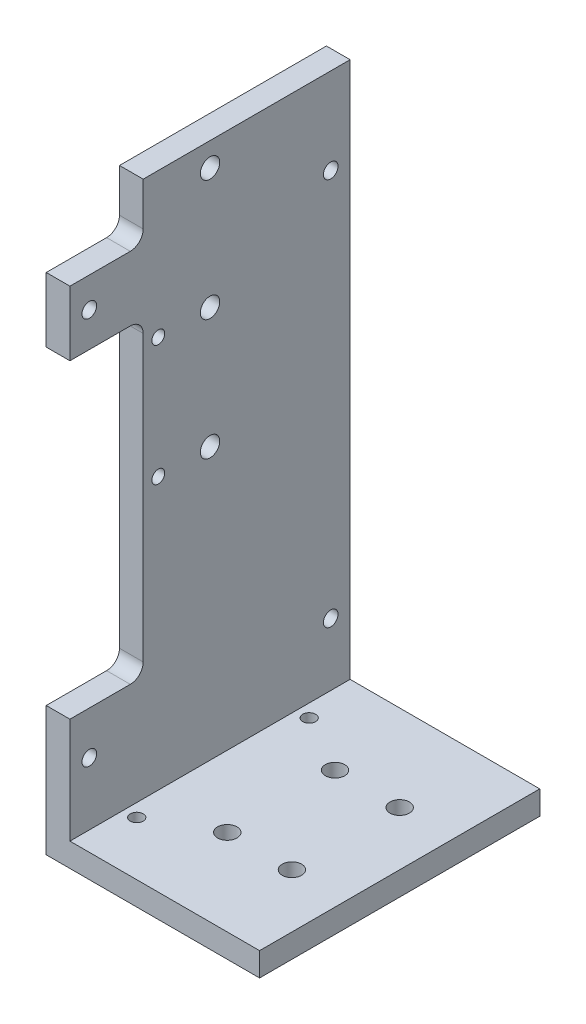
ISO-10303-21;
HEADER;
FILE_DESCRIPTION(('STEP AP214'),'2;1');
FILE_NAME('part.step','',(''),(''),'','','');
FILE_SCHEMA(('AUTOMOTIVE_DESIGN { 1 0 10303 214 1 1 1 1 }'));
ENDSEC;
DATA;
#1=APPLICATION_CONTEXT('core data for automotive mechanical design processes');
#2=APPLICATION_PROTOCOL_DEFINITION('international standard','automotive_design',2000,#1);
#3=PRODUCT_CONTEXT('',#1,'mechanical');
#4=PRODUCT('Part','Part','',(#3));
#5=PRODUCT_RELATED_PRODUCT_CATEGORY('part','',(#4));
#6=PRODUCT_DEFINITION_FORMATION('','',#4);
#7=PRODUCT_DEFINITION_CONTEXT('part definition',#1,'design');
#8=PRODUCT_DEFINITION('design','',#6,#7);
#9=PRODUCT_DEFINITION_SHAPE('','',#8);
#10=(LENGTH_UNIT() NAMED_UNIT(*) SI_UNIT(.MILLI.,.METRE.));
#11=(NAMED_UNIT(*) PLANE_ANGLE_UNIT() SI_UNIT($,.RADIAN.));
#12=(NAMED_UNIT(*) SI_UNIT($,.STERADIAN.) SOLID_ANGLE_UNIT());
#13=UNCERTAINTY_MEASURE_WITH_UNIT(LENGTH_MEASURE(1.E-05),#10,'distance_accuracy_value','');
#14=(GEOMETRIC_REPRESENTATION_CONTEXT(3) GLOBAL_UNCERTAINTY_ASSIGNED_CONTEXT((#13)) GLOBAL_UNIT_ASSIGNED_CONTEXT((#10,
#11,#12)) REPRESENTATION_CONTEXT('',''));
#15=CARTESIAN_POINT('',(0.,0.,0.));
#16=DIRECTION('',(0.,0.,1.));
#17=DIRECTION('',(1.,0.,0.));
#18=AXIS2_PLACEMENT_3D('',#15,#16,#17);
#19=CARTESIAN_POINT('',(22.,0.,12.5));
#20=DIRECTION('',(0.,-1.,0.));
#21=DIRECTION('',(0.,0.,-1.));
#22=AXIS2_PLACEMENT_3D('',#19,#20,#21);
#23=CYLINDRICAL_SURFACE('',#22,2.25);
#24=CARTESIAN_POINT('',(22.,0.,12.5));
#25=DIRECTION('',(0.,-1.,0.));
#26=DIRECTION('',(0.,0.,-1.));
#27=AXIS2_PLACEMENT_3D('',#24,#25,#26);
#28=CIRCLE('',#27,2.25);
#29=CARTESIAN_POINT('',(22.,0.,10.25));
#30=VERTEX_POINT('',#29);
#31=EDGE_CURVE('E271',#30,#30,#28,.F.);
#32=ORIENTED_EDGE('',*,*,#31,.F.);
#33=EDGE_LOOP('',(#32));
#34=FACE_BOUND('',#33,.T.);
#35=CARTESIAN_POINT('',(22.,5.5,12.5));
#36=DIRECTION('',(0.,-1.,0.));
#37=DIRECTION('',(0.,0.,-1.));
#38=AXIS2_PLACEMENT_3D('',#35,#36,#37);
#39=CIRCLE('',#38,2.25);
#40=CARTESIAN_POINT('',(22.,5.5,10.25));
#41=VERTEX_POINT('',#40);
#42=EDGE_CURVE('E19',#41,#41,#39,.T.);
#43=ORIENTED_EDGE('',*,*,#42,.F.);
#44=EDGE_LOOP('',(#43));
#45=FACE_BOUND('',#44,.T.);
#46=ADVANCED_FACE('F16',(#34,#45),#23,.F.);
#47=CARTESIAN_POINT('',(22.,0.,-12.5));
#48=DIRECTION('',(0.,-1.,0.));
#49=DIRECTION('',(0.,0.,-1.));
#50=AXIS2_PLACEMENT_3D('',#47,#48,#49);
#51=CYLINDRICAL_SURFACE('',#50,2.25);
#52=CARTESIAN_POINT('',(22.,0.,-12.5));
#53=DIRECTION('',(0.,-1.,0.));
#54=DIRECTION('',(0.,0.,-1.));
#55=AXIS2_PLACEMENT_3D('',#52,#53,#54);
#56=CIRCLE('',#55,2.25);
#57=CARTESIAN_POINT('',(22.,0.,-14.75));
#58=VERTEX_POINT('',#57);
#59=EDGE_CURVE('E268',#58,#58,#56,.F.);
#60=ORIENTED_EDGE('',*,*,#59,.F.);
#61=EDGE_LOOP('',(#60));
#62=FACE_BOUND('',#61,.T.);
#63=CARTESIAN_POINT('',(22.,5.5,-12.5));
#64=DIRECTION('',(0.,-1.,0.));
#65=DIRECTION('',(0.,0.,-1.));
#66=AXIS2_PLACEMENT_3D('',#63,#64,#65);
#67=CIRCLE('',#66,2.25);
#68=CARTESIAN_POINT('',(22.,5.5,-14.75));
#69=VERTEX_POINT('',#68);
#70=EDGE_CURVE('E299',#69,#69,#67,.T.);
#71=ORIENTED_EDGE('',*,*,#70,.F.);
#72=EDGE_LOOP('',(#71));
#73=FACE_BOUND('',#72,.T.);
#74=ADVANCED_FACE('F309',(#62,#73),#51,.F.);
#75=CARTESIAN_POINT('',(37.,0.,-12.5));
#76=DIRECTION('',(0.,-1.,0.));
#77=DIRECTION('',(0.,0.,-1.));
#78=AXIS2_PLACEMENT_3D('',#75,#76,#77);
#79=CYLINDRICAL_SURFACE('',#78,2.25);
#80=CARTESIAN_POINT('',(37.,0.,-12.5));
#81=DIRECTION('',(0.,-1.,0.));
#82=DIRECTION('',(0.,0.,-1.));
#83=AXIS2_PLACEMENT_3D('',#80,#81,#82);
#84=CIRCLE('',#83,2.25);
#85=CARTESIAN_POINT('',(37.,0.,-14.75));
#86=VERTEX_POINT('',#85);
#87=EDGE_CURVE('E265',#86,#86,#84,.F.);
#88=ORIENTED_EDGE('',*,*,#87,.F.);
#89=EDGE_LOOP('',(#88));
#90=FACE_BOUND('',#89,.T.);
#91=CARTESIAN_POINT('',(37.,5.5,-12.5));
#92=DIRECTION('',(0.,-1.,0.));
#93=DIRECTION('',(0.,0.,-1.));
#94=AXIS2_PLACEMENT_3D('',#91,#92,#93);
#95=CIRCLE('',#94,2.25);
#96=CARTESIAN_POINT('',(37.,5.5,-14.75));
#97=VERTEX_POINT('',#96);
#98=EDGE_CURVE('E297',#97,#97,#95,.T.);
#99=ORIENTED_EDGE('',*,*,#98,.F.);
#100=EDGE_LOOP('',(#99));
#101=FACE_BOUND('',#100,.T.);
#102=ADVANCED_FACE('F315',(#90,#101),#79,.F.);
#103=CARTESIAN_POINT('',(37.,0.,12.5));
#104=DIRECTION('',(0.,-1.,0.));
#105=DIRECTION('',(0.,0.,-1.));
#106=AXIS2_PLACEMENT_3D('',#103,#104,#105);
#107=CYLINDRICAL_SURFACE('',#106,2.25);
#108=CARTESIAN_POINT('',(37.,0.,12.5));
#109=DIRECTION('',(0.,-1.,0.));
#110=DIRECTION('',(0.,0.,-1.));
#111=AXIS2_PLACEMENT_3D('',#108,#109,#110);
#112=CIRCLE('',#111,2.25);
#113=CARTESIAN_POINT('',(37.,0.,10.25));
#114=VERTEX_POINT('',#113);
#115=EDGE_CURVE('E262',#114,#114,#112,.F.);
#116=ORIENTED_EDGE('',*,*,#115,.F.);
#117=EDGE_LOOP('',(#116));
#118=FACE_BOUND('',#117,.T.);
#119=CARTESIAN_POINT('',(37.,5.5,12.5));
#120=DIRECTION('',(0.,-1.,0.));
#121=DIRECTION('',(0.,0.,-1.));
#122=AXIS2_PLACEMENT_3D('',#119,#120,#121);
#123=CIRCLE('',#122,2.25);
#124=CARTESIAN_POINT('',(37.,5.5,10.25));
#125=VERTEX_POINT('',#124);
#126=EDGE_CURVE('E294',#125,#125,#123,.T.);
#127=ORIENTED_EDGE('',*,*,#126,.F.);
#128=EDGE_LOOP('',(#127));
#129=FACE_BOUND('',#128,.T.);
#130=ADVANCED_FACE('F426',(#118,#129),#107,.F.);
#131=CARTESIAN_POINT('',(8.5,0.,-20.));
#132=DIRECTION('',(0.,-1.,0.));
#133=DIRECTION('',(0.,0.,-1.));
#134=AXIS2_PLACEMENT_3D('',#131,#132,#133);
#135=CYLINDRICAL_SURFACE('',#134,1.49499999999999);
#136=CARTESIAN_POINT('',(8.5,0.,-20.));
#137=DIRECTION('',(0.,-1.,0.));
#138=DIRECTION('',(0.,0.,-1.));
#139=AXIS2_PLACEMENT_3D('',#136,#137,#138);
#140=CIRCLE('',#139,1.49499999999999);
#141=CARTESIAN_POINT('',(8.5,0.,-21.495));
#142=VERTEX_POINT('',#141);
#143=EDGE_CURVE('E259',#142,#142,#140,.F.);
#144=ORIENTED_EDGE('',*,*,#143,.F.);
#145=EDGE_LOOP('',(#144));
#146=FACE_BOUND('',#145,.T.);
#147=CARTESIAN_POINT('',(8.5,5.5,-20.));
#148=DIRECTION('',(0.,-1.,0.));
#149=DIRECTION('',(0.,0.,-1.));
#150=AXIS2_PLACEMENT_3D('',#147,#148,#149);
#151=CIRCLE('',#150,1.49499999999999);
#152=CARTESIAN_POINT('',(8.5,5.5,-21.495));
#153=VERTEX_POINT('',#152);
#154=EDGE_CURVE('E291',#153,#153,#151,.T.);
#155=ORIENTED_EDGE('',*,*,#154,.F.);
#156=EDGE_LOOP('',(#155));
#157=FACE_BOUND('',#156,.T.);
#158=ADVANCED_FACE('F422',(#146,#157),#135,.F.);
#159=CARTESIAN_POINT('',(8.5,0.,20.));
#160=DIRECTION('',(0.,-1.,0.));
#161=DIRECTION('',(0.,0.,-1.));
#162=AXIS2_PLACEMENT_3D('',#159,#160,#161);
#163=CYLINDRICAL_SURFACE('',#162,1.49499999999999);
#164=CARTESIAN_POINT('',(8.5,0.,20.));
#165=DIRECTION('',(0.,-1.,0.));
#166=DIRECTION('',(0.,0.,-1.));
#167=AXIS2_PLACEMENT_3D('',#164,#165,#166);
#168=CIRCLE('',#167,1.49499999999999);
#169=CARTESIAN_POINT('',(8.5,0.,18.505));
#170=VERTEX_POINT('',#169);
#171=EDGE_CURVE('E255',#170,#170,#168,.F.);
#172=ORIENTED_EDGE('',*,*,#171,.F.);
#173=EDGE_LOOP('',(#172));
#174=FACE_BOUND('',#173,.T.);
#175=CARTESIAN_POINT('',(8.5,5.5,20.));
#176=DIRECTION('',(0.,-1.,0.));
#177=DIRECTION('',(0.,0.,-1.));
#178=AXIS2_PLACEMENT_3D('',#175,#176,#177);
#179=CIRCLE('',#178,1.49499999999999);
#180=CARTESIAN_POINT('',(8.5,5.5,18.505));
#181=VERTEX_POINT('',#180);
#182=EDGE_CURVE('E175',#181,#181,#179,.T.);
#183=ORIENTED_EDGE('',*,*,#182,.F.);
#184=EDGE_LOOP('',(#183));
#185=FACE_BOUND('',#184,.T.);
#186=ADVANCED_FACE('F418',(#174,#185),#163,.F.);
#187=CARTESIAN_POINT('',(5.50000000000001,5.5,-32.5));
#188=DIRECTION('',(0.,1.,0.));
#189=DIRECTION('',(0.,0.,1.));
#190=AXIS2_PLACEMENT_3D('',#187,#188,#189);
#191=PLANE('',#190);
#192=DIRECTION('',(0.,0.,-1.));
#193=VECTOR('',#192,1.);
#194=CARTESIAN_POINT('',(49.5,5.5,-32.5));
#195=LINE('',#194,#193);
#196=CARTESIAN_POINT('',(49.5,5.5,-32.5));
#197=VERTEX_POINT('',#196);
#198=CARTESIAN_POINT('',(49.5,5.5,32.5));
#199=VERTEX_POINT('',#198);
#200=EDGE_CURVE('E165',#197,#199,#195,.F.);
#201=ORIENTED_EDGE('',*,*,#200,.F.);
#202=DIRECTION('',(-1.,0.,0.));
#203=VECTOR('',#202,1.);
#204=CARTESIAN_POINT('',(0.,5.5,-32.5));
#205=LINE('',#204,#203);
#206=CARTESIAN_POINT('',(5.50000000000001,5.49999999999999,-32.5));
#207=VERTEX_POINT('',#206);
#208=EDGE_CURVE('E686',#207,#197,#205,.F.);
#209=ORIENTED_EDGE('',*,*,#208,.F.);
#210=DIRECTION('',(0.,0.,1.));
#211=VECTOR('',#210,1.);
#212=CARTESIAN_POINT('',(5.50000000000001,5.49999999999999,-32.5));
#213=LINE('',#212,#211);
#214=CARTESIAN_POINT('',(5.50000000000001,5.49999999999999,32.5));
#215=VERTEX_POINT('',#214);
#216=EDGE_CURVE('E163',#215,#207,#213,.F.);
#217=ORIENTED_EDGE('',*,*,#216,.F.);
#218=DIRECTION('',(-1.,0.,0.));
#219=VECTOR('',#218,1.);
#220=CARTESIAN_POINT('',(0.,5.5,32.5));
#221=LINE('',#220,#219);
#222=EDGE_CURVE('E689',#215,#199,#221,.F.);
#223=ORIENTED_EDGE('',*,*,#222,.T.);
#224=EDGE_LOOP('',(#201,#209,#217,#223));
#225=FACE_BOUND('',#224,.T.);
#226=ORIENTED_EDGE('',*,*,#182,.T.);
#227=EDGE_LOOP('',(#226));
#228=FACE_BOUND('',#227,.T.);
#229=ORIENTED_EDGE('',*,*,#154,.T.);
#230=EDGE_LOOP('',(#229));
#231=FACE_BOUND('',#230,.T.);
#232=ORIENTED_EDGE('',*,*,#126,.T.);
#233=EDGE_LOOP('',(#232));
#234=FACE_BOUND('',#233,.T.);
#235=ORIENTED_EDGE('',*,*,#98,.T.);
#236=EDGE_LOOP('',(#235));
#237=FACE_BOUND('',#236,.T.);
#238=ORIENTED_EDGE('',*,*,#70,.T.);
#239=EDGE_LOOP('',(#238));
#240=FACE_BOUND('',#239,.T.);
#241=ORIENTED_EDGE('',*,*,#42,.T.);
#242=EDGE_LOOP('',(#241));
#243=FACE_BOUND('',#242,.T.);
#244=ADVANCED_FACE('F306',(#225,#228,#231,#234,#237,#240,#243),#191,.T.);
#245=CARTESIAN_POINT('',(49.5,5.5,-32.5));
#246=DIRECTION('',(1.,0.,0.));
#247=DIRECTION('',(0.,0.,-1.));
#248=AXIS2_PLACEMENT_3D('',#245,#246,#247);
#249=PLANE('',#248);
#250=DIRECTION('',(0.,0.,1.));
#251=VECTOR('',#250,1.);
#252=CARTESIAN_POINT('',(49.5,0.,-32.5));
#253=LINE('',#252,#251);
#254=CARTESIAN_POINT('',(49.5,0.,-32.5));
#255=VERTEX_POINT('',#254);
#256=CARTESIAN_POINT('',(49.5,0.,32.5));
#257=VERTEX_POINT('',#256);
#258=EDGE_CURVE('E258',#255,#257,#253,.T.);
#259=ORIENTED_EDGE('',*,*,#258,.F.);
#260=DIRECTION('',(0.,1.,0.));
#261=VECTOR('',#260,1.);
#262=CARTESIAN_POINT('',(49.5,0.,-32.5));
#263=LINE('',#262,#261);
#264=EDGE_CURVE('E274',#197,#255,#263,.F.);
#265=ORIENTED_EDGE('',*,*,#264,.F.);
#266=ORIENTED_EDGE('',*,*,#200,.T.);
#267=DIRECTION('',(0.,1.,0.));
#268=VECTOR('',#267,1.);
#269=CARTESIAN_POINT('',(49.5,0.,32.5));
#270=LINE('',#269,#268);
#271=EDGE_CURVE('E739',#199,#257,#270,.F.);
#272=ORIENTED_EDGE('',*,*,#271,.T.);
#273=EDGE_LOOP('',(#259,#265,#266,#272));
#274=FACE_BOUND('',#273,.T.);
#275=ADVANCED_FACE('F411',(#274),#249,.T.);
#276=CARTESIAN_POINT('',(5.5,130.,-32.5));
#277=DIRECTION('',(1.,0.,0.));
#278=DIRECTION('',(0.,1.,0.));
#279=AXIS2_PLACEMENT_3D('',#276,#277,#278);
#280=PLANE('',#279);
#281=CARTESIAN_POINT('',(5.5,124.5,0.));
#282=DIRECTION('',(-1.,0.,0.));
#283=DIRECTION('',(0.,0.,1.));
#284=AXIS2_PLACEMENT_3D('',#281,#282,#283);
#285=CIRCLE('',#284,2.25);
#286=CARTESIAN_POINT('',(5.5,124.5,2.25));
#287=VERTEX_POINT('',#286);
#288=EDGE_CURVE('E241',#287,#287,#285,.T.);
#289=ORIENTED_EDGE('',*,*,#288,.T.);
#290=EDGE_LOOP('',(#289));
#291=FACE_BOUND('',#290,.T.);
#292=CARTESIAN_POINT('',(5.5,96.5,0.));
#293=DIRECTION('',(-1.,0.,0.));
#294=DIRECTION('',(0.,0.,1.));
#295=AXIS2_PLACEMENT_3D('',#292,#293,#294);
#296=CIRCLE('',#295,2.25);
#297=CARTESIAN_POINT('',(5.5,96.5,2.25));
#298=VERTEX_POINT('',#297);
#299=EDGE_CURVE('E244',#298,#298,#296,.T.);
#300=ORIENTED_EDGE('',*,*,#299,.T.);
#301=EDGE_LOOP('',(#300));
#302=FACE_BOUND('',#301,.T.);
#303=CARTESIAN_POINT('',(5.5,68.5,0.));
#304=DIRECTION('',(-1.,0.,0.));
#305=DIRECTION('',(0.,0.,1.));
#306=AXIS2_PLACEMENT_3D('',#303,#304,#305);
#307=CIRCLE('',#306,2.25);
#308=CARTESIAN_POINT('',(5.5,68.5,2.25));
#309=VERTEX_POINT('',#308);
#310=EDGE_CURVE('E247',#309,#309,#307,.T.);
#311=ORIENTED_EDGE('',*,*,#310,.T.);
#312=EDGE_LOOP('',(#311));
#313=FACE_BOUND('',#312,.T.);
#314=CARTESIAN_POINT('',(5.5,96.5,12.));
#315=DIRECTION('',(-1.,0.,0.));
#316=DIRECTION('',(0.,0.,1.));
#317=AXIS2_PLACEMENT_3D('',#314,#315,#316);
#318=CIRCLE('',#317,1.49500000000001);
#319=CARTESIAN_POINT('',(5.5,96.5,13.495));
#320=VERTEX_POINT('',#319);
#321=EDGE_CURVE('E250',#320,#320,#318,.T.);
#322=ORIENTED_EDGE('',*,*,#321,.T.);
#323=EDGE_LOOP('',(#322));
#324=FACE_BOUND('',#323,.T.);
#325=CARTESIAN_POINT('',(5.5,68.5,12.));
#326=DIRECTION('',(-1.,0.,0.));
#327=DIRECTION('',(0.,0.,1.));
#328=AXIS2_PLACEMENT_3D('',#325,#326,#327);
#329=CIRCLE('',#328,1.49500000000001);
#330=CARTESIAN_POINT('',(5.5,68.5,13.495));
#331=VERTEX_POINT('',#330);
#332=EDGE_CURVE('E170',#331,#331,#329,.T.);
#333=ORIENTED_EDGE('',*,*,#332,.T.);
#334=EDGE_LOOP('',(#333));
#335=FACE_BOUND('',#334,.T.);
#336=DIRECTION('',(0.,1.,0.));
#337=VECTOR('',#336,1.);
#338=CARTESIAN_POINT('',(5.5,30.,15.5));
#339=LINE('',#338,#337);
#340=CARTESIAN_POINT('',(5.5,99.,15.5));
#341=VERTEX_POINT('',#340);
#342=CARTESIAN_POINT('',(5.5,33.,15.5));
#343=VERTEX_POINT('',#342);
#344=EDGE_CURVE('E121',#341,#343,#339,.F.);
#345=ORIENTED_EDGE('',*,*,#344,.T.);
#346=CARTESIAN_POINT('',(5.50000000000001,33.,18.5));
#347=DIRECTION('',(1.,0.,0.));
#348=DIRECTION('',(0.,0.,-1.));
#349=AXIS2_PLACEMENT_3D('',#346,#347,#348);
#350=CIRCLE('',#349,3.);
#351=CARTESIAN_POINT('',(5.50000000000001,30.,18.5));
#352=VERTEX_POINT('',#351);
#353=EDGE_CURVE('E137',#343,#352,#350,.F.);
#354=ORIENTED_EDGE('',*,*,#353,.T.);
#355=DIRECTION('',(0.,0.,-1.));
#356=VECTOR('',#355,1.);
#357=CARTESIAN_POINT('',(5.50000000000001,30.,32.5));
#358=LINE('',#357,#356);
#359=CARTESIAN_POINT('',(5.50000000000001,30.,32.5));
#360=VERTEX_POINT('',#359);
#361=EDGE_CURVE('E126',#352,#360,#358,.F.);
#362=ORIENTED_EDGE('',*,*,#361,.T.);
#363=DIRECTION('',(0.,1.,0.));
#364=VECTOR('',#363,1.);
#365=CARTESIAN_POINT('',(5.5,0.,32.5));
#366=LINE('',#365,#364);
#367=EDGE_CURVE('E153',#360,#215,#366,.F.);
#368=ORIENTED_EDGE('',*,*,#367,.T.);
#369=ORIENTED_EDGE('',*,*,#216,.T.);
#370=DIRECTION('',(0.,1.,0.));
#371=VECTOR('',#370,1.);
#372=CARTESIAN_POINT('',(5.5,0.,-32.5));
#373=LINE('',#372,#371);
#374=CARTESIAN_POINT('',(5.5,130.,-32.5));
#375=VERTEX_POINT('',#374);
#376=EDGE_CURVE('E696',#375,#207,#373,.F.);
#377=ORIENTED_EDGE('',*,*,#376,.F.);
#378=DIRECTION('',(0.,0.,1.));
#379=VECTOR('',#378,1.);
#380=CARTESIAN_POINT('',(5.5,130.,-32.5));
#381=LINE('',#380,#379);
#382=CARTESIAN_POINT('',(5.5,130.,15.5));
#383=VERTEX_POINT('',#382);
#384=EDGE_CURVE('E182',#383,#375,#381,.F.);
#385=ORIENTED_EDGE('',*,*,#384,.F.);
#386=DIRECTION('',(0.,1.,0.));
#387=VECTOR('',#386,1.);
#388=CARTESIAN_POINT('',(5.5,117.,15.5));
#389=LINE('',#388,#387);
#390=CARTESIAN_POINT('',(5.5,120.,15.5));
#391=VERTEX_POINT('',#390);
#392=EDGE_CURVE('E176',#383,#391,#389,.F.);
#393=ORIENTED_EDGE('',*,*,#392,.T.);
#394=CARTESIAN_POINT('',(5.5,120.,18.5));
#395=DIRECTION('',(1.,0.,0.));
#396=DIRECTION('',(0.,0.,-1.));
#397=AXIS2_PLACEMENT_3D('',#394,#395,#396);
#398=CIRCLE('',#397,3.);
#399=CARTESIAN_POINT('',(5.5,117.,18.5));
#400=VERTEX_POINT('',#399);
#401=EDGE_CURVE('E179',#391,#400,#398,.F.);
#402=ORIENTED_EDGE('',*,*,#401,.T.);
#403=DIRECTION('',(0.,0.,-1.));
#404=VECTOR('',#403,1.);
#405=CARTESIAN_POINT('',(5.5,117.,32.5));
#406=LINE('',#405,#404);
#407=CARTESIAN_POINT('',(5.5,117.,32.5));
#408=VERTEX_POINT('',#407);
#409=EDGE_CURVE('E188',#400,#408,#406,.F.);
#410=ORIENTED_EDGE('',*,*,#409,.T.);
#411=DIRECTION('',(0.,1.,0.));
#412=VECTOR('',#411,1.);
#413=CARTESIAN_POINT('',(5.5,0.,32.5));
#414=LINE('',#413,#412);
#415=CARTESIAN_POINT('',(5.5,102.,32.5));
#416=VERTEX_POINT('',#415);
#417=EDGE_CURVE('E195',#408,#416,#414,.F.);
#418=ORIENTED_EDGE('',*,*,#417,.T.);
#419=DIRECTION('',(0.,0.,1.));
#420=VECTOR('',#419,1.);
#421=CARTESIAN_POINT('',(5.5,102.,32.5));
#422=LINE('',#421,#420);
#423=CARTESIAN_POINT('',(5.5,102.,18.5));
#424=VERTEX_POINT('',#423);
#425=EDGE_CURVE('E201',#416,#424,#422,.F.);
#426=ORIENTED_EDGE('',*,*,#425,.T.);
#427=CARTESIAN_POINT('',(5.5,99.,18.5));
#428=DIRECTION('',(1.,0.,0.));
#429=DIRECTION('',(0.,0.,-1.));
#430=AXIS2_PLACEMENT_3D('',#427,#428,#429);
#431=CIRCLE('',#430,3.);
#432=EDGE_CURVE('E203',#424,#341,#431,.F.);
#433=ORIENTED_EDGE('',*,*,#432,.T.);
#434=EDGE_LOOP('',(#345,#354,#362,#368,#369,#377,#385,#393,#402,#410,#418,#426,#433));
#435=FACE_BOUND('',#434,.T.);
#436=CARTESIAN_POINT('',(5.5,110.,28.));
#437=DIRECTION('',(-1.,0.,0.));
#438=DIRECTION('',(0.,0.,1.));
#439=AXIS2_PLACEMENT_3D('',#436,#437,#438);
#440=CIRCLE('',#439,1.69999999999999);
#441=CARTESIAN_POINT('',(5.5,110.,29.7));
#442=VERTEX_POINT('',#441);
#443=EDGE_CURVE('E135',#442,#442,#440,.T.);
#444=ORIENTED_EDGE('',*,*,#443,.T.);
#445=EDGE_LOOP('',(#444));
#446=FACE_BOUND('',#445,.T.);
#447=CARTESIAN_POINT('',(5.50000000000001,20.,28.));
#448=DIRECTION('',(-1.,0.,0.));
#449=DIRECTION('',(0.,0.,1.));
#450=AXIS2_PLACEMENT_3D('',#447,#448,#449);
#451=CIRCLE('',#450,1.7);
#452=CARTESIAN_POINT('',(5.50000000000001,20.,29.7));
#453=VERTEX_POINT('',#452);
#454=EDGE_CURVE('E281',#453,#453,#451,.T.);
#455=ORIENTED_EDGE('',*,*,#454,.T.);
#456=EDGE_LOOP('',(#455));
#457=FACE_BOUND('',#456,.T.);
#458=CARTESIAN_POINT('',(5.5,110.,-28.));
#459=DIRECTION('',(-1.,0.,0.));
#460=DIRECTION('',(0.,0.,1.));
#461=AXIS2_PLACEMENT_3D('',#458,#459,#460);
#462=CIRCLE('',#461,1.69999999999999);
#463=CARTESIAN_POINT('',(5.5,110.,-26.3));
#464=VERTEX_POINT('',#463);
#465=EDGE_CURVE('E284',#464,#464,#462,.T.);
#466=ORIENTED_EDGE('',*,*,#465,.T.);
#467=EDGE_LOOP('',(#466));
#468=FACE_BOUND('',#467,.T.);
#469=CARTESIAN_POINT('',(5.50000000000001,20.,-28.));
#470=DIRECTION('',(-1.,0.,0.));
#471=DIRECTION('',(0.,0.,1.));
#472=AXIS2_PLACEMENT_3D('',#469,#470,#471);
#473=CIRCLE('',#472,1.7);
#474=CARTESIAN_POINT('',(5.50000000000001,20.,-26.3));
#475=VERTEX_POINT('',#474);
#476=EDGE_CURVE('E164',#475,#475,#473,.T.);
#477=ORIENTED_EDGE('',*,*,#476,.T.);
#478=EDGE_LOOP('',(#477));
#479=FACE_BOUND('',#478,.T.);
#480=ADVANCED_FACE('F138',(#291,#302,#313,#324,#335,#435,#446,#457,#468,#479),#280,.T.);
#481=CARTESIAN_POINT('',(0.,20.,-28.));
#482=DIRECTION('',(-1.,0.,0.));
#483=DIRECTION('',(0.,0.,1.));
#484=AXIS2_PLACEMENT_3D('',#481,#482,#483);
#485=CYLINDRICAL_SURFACE('',#484,1.7);
#486=CARTESIAN_POINT('',(0.,20.,-28.));
#487=DIRECTION('',(-1.,0.,0.));
#488=DIRECTION('',(0.,0.,1.));
#489=AXIS2_PLACEMENT_3D('',#486,#487,#488);
#490=CIRCLE('',#489,1.7);
#491=CARTESIAN_POINT('',(0.,20.,-26.3));
#492=VERTEX_POINT('',#491);
#493=EDGE_CURVE('E238',#492,#492,#490,.F.);
#494=ORIENTED_EDGE('',*,*,#493,.F.);
#495=EDGE_LOOP('',(#494));
#496=FACE_BOUND('',#495,.T.);
#497=ORIENTED_EDGE('',*,*,#476,.F.);
#498=EDGE_LOOP('',(#497));
#499=FACE_BOUND('',#498,.T.);
#500=ADVANCED_FACE('F404',(#496,#499),#485,.F.);
#501=CARTESIAN_POINT('',(0.,110.,-28.));
#502=DIRECTION('',(-1.,0.,0.));
#503=DIRECTION('',(0.,0.,1.));
#504=AXIS2_PLACEMENT_3D('',#501,#502,#503);
#505=CYLINDRICAL_SURFACE('',#504,1.69999999999999);
#506=CARTESIAN_POINT('',(0.,110.,-28.));
#507=DIRECTION('',(-1.,0.,0.));
#508=DIRECTION('',(0.,0.,1.));
#509=AXIS2_PLACEMENT_3D('',#506,#507,#508);
#510=CIRCLE('',#509,1.69999999999999);
#511=CARTESIAN_POINT('',(0.,110.,-26.3));
#512=VERTEX_POINT('',#511);
#513=EDGE_CURVE('E235',#512,#512,#510,.F.);
#514=ORIENTED_EDGE('',*,*,#513,.F.);
#515=EDGE_LOOP('',(#514));
#516=FACE_BOUND('',#515,.T.);
#517=ORIENTED_EDGE('',*,*,#465,.F.);
#518=EDGE_LOOP('',(#517));
#519=FACE_BOUND('',#518,.T.);
#520=ADVANCED_FACE('F400',(#516,#519),#505,.F.);
#521=CARTESIAN_POINT('',(0.,20.,28.));
#522=DIRECTION('',(-1.,0.,0.));
#523=DIRECTION('',(0.,0.,1.));
#524=AXIS2_PLACEMENT_3D('',#521,#522,#523);
#525=CYLINDRICAL_SURFACE('',#524,1.7);
#526=CARTESIAN_POINT('',(0.,20.,28.));
#527=DIRECTION('',(-1.,0.,0.));
#528=DIRECTION('',(0.,0.,1.));
#529=AXIS2_PLACEMENT_3D('',#526,#527,#528);
#530=CIRCLE('',#529,1.7);
#531=CARTESIAN_POINT('',(0.,20.,29.7));
#532=VERTEX_POINT('',#531);
#533=EDGE_CURVE('E232',#532,#532,#530,.F.);
#534=ORIENTED_EDGE('',*,*,#533,.F.);
#535=EDGE_LOOP('',(#534));
#536=FACE_BOUND('',#535,.T.);
#537=ORIENTED_EDGE('',*,*,#454,.F.);
#538=EDGE_LOOP('',(#537));
#539=FACE_BOUND('',#538,.T.);
#540=ADVANCED_FACE('F396',(#536,#539),#525,.F.);
#541=CARTESIAN_POINT('',(0.,110.,28.));
#542=DIRECTION('',(-1.,0.,0.));
#543=DIRECTION('',(0.,0.,1.));
#544=AXIS2_PLACEMENT_3D('',#541,#542,#543);
#545=CYLINDRICAL_SURFACE('',#544,1.69999999999999);
#546=CARTESIAN_POINT('',(0.,110.,28.));
#547=DIRECTION('',(-1.,0.,0.));
#548=DIRECTION('',(0.,0.,1.));
#549=AXIS2_PLACEMENT_3D('',#546,#547,#548);
#550=CIRCLE('',#549,1.69999999999999);
#551=CARTESIAN_POINT('',(0.,110.,29.7));
#552=VERTEX_POINT('',#551);
#553=EDGE_CURVE('E229',#552,#552,#550,.F.);
#554=ORIENTED_EDGE('',*,*,#553,.F.);
#555=EDGE_LOOP('',(#554));
#556=FACE_BOUND('',#555,.T.);
#557=ORIENTED_EDGE('',*,*,#443,.F.);
#558=EDGE_LOOP('',(#557));
#559=FACE_BOUND('',#558,.T.);
#560=ADVANCED_FACE('F393',(#556,#559),#545,.F.);
#561=CARTESIAN_POINT('',(10.,30.,32.5));
#562=DIRECTION('',(0.,-1.,0.));
#563=DIRECTION('',(0.,0.,-1.));
#564=AXIS2_PLACEMENT_3D('',#561,#562,#563);
#565=PLANE('',#564);
#566=DIRECTION('',(1.,0.,0.));
#567=VECTOR('',#566,1.);
#568=CARTESIAN_POINT('',(10.,30.,18.5));
#569=LINE('',#568,#567);
#570=CARTESIAN_POINT('',(0.,30.,18.5));
#571=VERTEX_POINT('',#570);
#572=EDGE_CURVE('E129',#352,#571,#569,.F.);
#573=ORIENTED_EDGE('',*,*,#572,.T.);
#574=DIRECTION('',(0.,0.,1.));
#575=VECTOR('',#574,1.);
#576=CARTESIAN_POINT('',(0.,30.,-32.5));
#577=LINE('',#576,#575);
#578=CARTESIAN_POINT('',(0.,30.,32.5));
#579=VERTEX_POINT('',#578);
#580=EDGE_CURVE('E228',#579,#571,#577,.F.);
#581=ORIENTED_EDGE('',*,*,#580,.F.);
#582=DIRECTION('',(-1.,0.,0.));
#583=VECTOR('',#582,1.);
#584=CARTESIAN_POINT('',(0.,30.,32.5));
#585=LINE('',#584,#583);
#586=EDGE_CURVE('E132',#579,#360,#585,.F.);
#587=ORIENTED_EDGE('',*,*,#586,.T.);
#588=ORIENTED_EDGE('',*,*,#361,.F.);
#589=EDGE_LOOP('',(#573,#581,#587,#588));
#590=FACE_BOUND('',#589,.T.);
#591=ADVANCED_FACE('F127',(#590),#565,.F.);
#592=CARTESIAN_POINT('',(10.,33.,18.5));
#593=DIRECTION('',(1.,0.,0.));
#594=DIRECTION('',(0.,0.,-1.));
#595=AXIS2_PLACEMENT_3D('',#592,#593,#594);
#596=CYLINDRICAL_SURFACE('',#595,3.);
#597=DIRECTION('',(-1.,0.,0.));
#598=VECTOR('',#597,1.);
#599=CARTESIAN_POINT('',(10.,33.,15.5));
#600=LINE('',#599,#598);
#601=CARTESIAN_POINT('',(0.,33.,15.5));
#602=VERTEX_POINT('',#601);
#603=EDGE_CURVE('E150',#343,#602,#600,.T.);
#604=ORIENTED_EDGE('',*,*,#603,.T.);
#605=CARTESIAN_POINT('',(0.,33.,18.5));
#606=DIRECTION('',(1.,0.,0.));
#607=DIRECTION('',(0.,0.,-1.));
#608=AXIS2_PLACEMENT_3D('',#605,#606,#607);
#609=CIRCLE('',#608,3.);
#610=EDGE_CURVE('E145',#571,#602,#609,.T.);
#611=ORIENTED_EDGE('',*,*,#610,.F.);
#612=ORIENTED_EDGE('',*,*,#572,.F.);
#613=ORIENTED_EDGE('',*,*,#353,.F.);
#614=EDGE_LOOP('',(#604,#611,#612,#613));
#615=FACE_BOUND('',#614,.T.);
#616=ADVANCED_FACE('F143',(#615),#596,.F.);
#617=CARTESIAN_POINT('',(10.,30.,15.5));
#618=DIRECTION('',(0.,0.,-1.));
#619=DIRECTION('',(-1.,0.,0.));
#620=AXIS2_PLACEMENT_3D('',#617,#618,#619);
#621=PLANE('',#620);
#622=ORIENTED_EDGE('',*,*,#603,.F.);
#623=ORIENTED_EDGE('',*,*,#344,.F.);
#624=DIRECTION('',(1.,0.,0.));
#625=VECTOR('',#624,1.);
#626=CARTESIAN_POINT('',(10.,99.,15.5));
#627=LINE('',#626,#625);
#628=CARTESIAN_POINT('',(0.,99.,15.5));
#629=VERTEX_POINT('',#628);
#630=EDGE_CURVE('E277',#341,#629,#627,.F.);
#631=ORIENTED_EDGE('',*,*,#630,.T.);
#632=DIRECTION('',(0.,1.,0.));
#633=VECTOR('',#632,1.);
#634=CARTESIAN_POINT('',(0.,0.,15.5));
#635=LINE('',#634,#633);
#636=EDGE_CURVE('E226',#602,#629,#635,.T.);
#637=ORIENTED_EDGE('',*,*,#636,.F.);
#638=EDGE_LOOP('',(#622,#623,#631,#637));
#639=FACE_BOUND('',#638,.T.);
#640=ADVANCED_FACE('F384',(#639),#621,.F.);
#641=CARTESIAN_POINT('',(10.,99.,18.5));
#642=DIRECTION('',(1.,0.,0.));
#643=DIRECTION('',(0.,0.,-1.));
#644=AXIS2_PLACEMENT_3D('',#641,#642,#643);
#645=CYLINDRICAL_SURFACE('',#644,3.);
#646=DIRECTION('',(1.,0.,0.));
#647=VECTOR('',#646,1.);
#648=CARTESIAN_POINT('',(10.,102.,18.5));
#649=LINE('',#648,#647);
#650=CARTESIAN_POINT('',(0.,102.,18.5));
#651=VERTEX_POINT('',#650);
#652=EDGE_CURVE('E198',#424,#651,#649,.F.);
#653=ORIENTED_EDGE('',*,*,#652,.T.);
#654=CARTESIAN_POINT('',(0.,99.,18.5));
#655=DIRECTION('',(1.,0.,0.));
#656=DIRECTION('',(0.,0.,-1.));
#657=AXIS2_PLACEMENT_3D('',#654,#655,#656);
#658=CIRCLE('',#657,3.);
#659=EDGE_CURVE('E222',#629,#651,#658,.T.);
#660=ORIENTED_EDGE('',*,*,#659,.F.);
#661=ORIENTED_EDGE('',*,*,#630,.F.);
#662=ORIENTED_EDGE('',*,*,#432,.F.);
#663=EDGE_LOOP('',(#653,#660,#661,#662));
#664=FACE_BOUND('',#663,.T.);
#665=ADVANCED_FACE('F380',(#664),#645,.F.);
#666=CARTESIAN_POINT('',(10.,102.,32.5));
#667=DIRECTION('',(0.,1.,0.));
#668=DIRECTION('',(0.,0.,1.));
#669=AXIS2_PLACEMENT_3D('',#666,#667,#668);
#670=PLANE('',#669);
#671=ORIENTED_EDGE('',*,*,#652,.F.);
#672=ORIENTED_EDGE('',*,*,#425,.F.);
#673=DIRECTION('',(-1.,0.,0.));
#674=VECTOR('',#673,1.);
#675=CARTESIAN_POINT('',(0.,102.,32.5));
#676=LINE('',#675,#674);
#677=CARTESIAN_POINT('',(0.,102.,32.5));
#678=VERTEX_POINT('',#677);
#679=EDGE_CURVE('E197',#416,#678,#676,.T.);
#680=ORIENTED_EDGE('',*,*,#679,.T.);
#681=DIRECTION('',(0.,0.,1.));
#682=VECTOR('',#681,1.);
#683=CARTESIAN_POINT('',(0.,102.,-32.5));
#684=LINE('',#683,#682);
#685=EDGE_CURVE('E225',#651,#678,#684,.T.);
#686=ORIENTED_EDGE('',*,*,#685,.F.);
#687=EDGE_LOOP('',(#671,#672,#680,#686));
#688=FACE_BOUND('',#687,.T.);
#689=ADVANCED_FACE('F376',(#688),#670,.F.);
#690=CARTESIAN_POINT('',(0.,0.,32.5));
#691=DIRECTION('',(0.,0.,-1.));
#692=DIRECTION('',(-1.,0.,0.));
#693=AXIS2_PLACEMENT_3D('',#690,#691,#692);
#694=PLANE('',#693);
#695=ORIENTED_EDGE('',*,*,#679,.F.);
#696=ORIENTED_EDGE('',*,*,#417,.F.);
#697=DIRECTION('',(1.,0.,0.));
#698=VECTOR('',#697,1.);
#699=CARTESIAN_POINT('',(10.,117.,32.5));
#700=LINE('',#699,#698);
#701=CARTESIAN_POINT('',(0.,117.,32.5));
#702=VERTEX_POINT('',#701);
#703=EDGE_CURVE('E192',#408,#702,#700,.F.);
#704=ORIENTED_EDGE('',*,*,#703,.T.);
#705=DIRECTION('',(0.,1.,0.));
#706=VECTOR('',#705,1.);
#707=CARTESIAN_POINT('',(0.,0.,32.5));
#708=LINE('',#707,#706);
#709=EDGE_CURVE('E717',#678,#702,#708,.T.);
#710=ORIENTED_EDGE('',*,*,#709,.F.);
#711=EDGE_LOOP('',(#695,#696,#704,#710));
#712=FACE_BOUND('',#711,.T.);
#713=ADVANCED_FACE('F372',(#712),#694,.F.);
#714=CARTESIAN_POINT('',(10.,117.,32.5));
#715=DIRECTION('',(0.,-1.,0.));
#716=DIRECTION('',(0.,0.,-1.));
#717=AXIS2_PLACEMENT_3D('',#714,#715,#716);
#718=PLANE('',#717);
#719=DIRECTION('',(1.,0.,0.));
#720=VECTOR('',#719,1.);
#721=CARTESIAN_POINT('',(10.,117.,18.5));
#722=LINE('',#721,#720);
#723=CARTESIAN_POINT('',(0.,117.,18.5));
#724=VERTEX_POINT('',#723);
#725=EDGE_CURVE('E191',#400,#724,#722,.F.);
#726=ORIENTED_EDGE('',*,*,#725,.T.);
#727=DIRECTION('',(0.,0.,1.));
#728=VECTOR('',#727,1.);
#729=CARTESIAN_POINT('',(0.,117.,-32.5));
#730=LINE('',#729,#728);
#731=EDGE_CURVE('E221',#702,#724,#730,.F.);
#732=ORIENTED_EDGE('',*,*,#731,.F.);
#733=ORIENTED_EDGE('',*,*,#703,.F.);
#734=ORIENTED_EDGE('',*,*,#409,.F.);
#735=EDGE_LOOP('',(#726,#732,#733,#734));
#736=FACE_BOUND('',#735,.T.);
#737=ADVANCED_FACE('F368',(#736),#718,.F.);
#738=CARTESIAN_POINT('',(10.,120.,18.5));
#739=DIRECTION('',(1.,0.,0.));
#740=DIRECTION('',(0.,0.,-1.));
#741=AXIS2_PLACEMENT_3D('',#738,#739,#740);
#742=CYLINDRICAL_SURFACE('',#741,3.);
#743=DIRECTION('',(-1.,0.,0.));
#744=VECTOR('',#743,1.);
#745=CARTESIAN_POINT('',(10.,120.,15.5));
#746=LINE('',#745,#744);
#747=CARTESIAN_POINT('',(0.,120.,15.5));
#748=VERTEX_POINT('',#747);
#749=EDGE_CURVE('E178',#391,#748,#746,.T.);
#750=ORIENTED_EDGE('',*,*,#749,.T.);
#751=CARTESIAN_POINT('',(0.,120.,18.5));
#752=DIRECTION('',(1.,0.,0.));
#753=DIRECTION('',(0.,0.,-1.));
#754=AXIS2_PLACEMENT_3D('',#751,#752,#753);
#755=CIRCLE('',#754,3.);
#756=EDGE_CURVE('E217',#724,#748,#755,.T.);
#757=ORIENTED_EDGE('',*,*,#756,.F.);
#758=ORIENTED_EDGE('',*,*,#725,.F.);
#759=ORIENTED_EDGE('',*,*,#401,.F.);
#760=EDGE_LOOP('',(#750,#757,#758,#759));
#761=FACE_BOUND('',#760,.T.);
#762=ADVANCED_FACE('F364',(#761),#742,.F.);
#763=CARTESIAN_POINT('',(10.,117.,15.5));
#764=DIRECTION('',(0.,0.,-1.));
#765=DIRECTION('',(-1.,0.,0.));
#766=AXIS2_PLACEMENT_3D('',#763,#764,#765);
#767=PLANE('',#766);
#768=ORIENTED_EDGE('',*,*,#749,.F.);
#769=ORIENTED_EDGE('',*,*,#392,.F.);
#770=DIRECTION('',(1.,0.,0.));
#771=VECTOR('',#770,1.);
#772=CARTESIAN_POINT('',(0.,130.,15.5));
#773=LINE('',#772,#771);
#774=CARTESIAN_POINT('',(0.,130.,15.5));
#775=VERTEX_POINT('',#774);
#776=EDGE_CURVE('E185',#775,#383,#773,.T.);
#777=ORIENTED_EDGE('',*,*,#776,.F.);
#778=DIRECTION('',(0.,1.,0.));
#779=VECTOR('',#778,1.);
#780=CARTESIAN_POINT('',(0.,0.,15.5));
#781=LINE('',#780,#779);
#782=EDGE_CURVE('E220',#748,#775,#781,.T.);
#783=ORIENTED_EDGE('',*,*,#782,.F.);
#784=EDGE_LOOP('',(#768,#769,#777,#783));
#785=FACE_BOUND('',#784,.T.);
#786=ADVANCED_FACE('F360',(#785),#767,.F.);
#787=CARTESIAN_POINT('',(0.,130.,-32.5));
#788=DIRECTION('',(0.,1.,0.));
#789=DIRECTION('',(0.,0.,1.));
#790=AXIS2_PLACEMENT_3D('',#787,#788,#789);
#791=PLANE('',#790);
#792=DIRECTION('',(-1.,0.,0.));
#793=VECTOR('',#792,1.);
#794=CARTESIAN_POINT('',(0.,130.,-32.5));
#795=LINE('',#794,#793);
#796=CARTESIAN_POINT('',(0.,130.,-32.5));
#797=VERTEX_POINT('',#796);
#798=EDGE_CURVE('E184',#797,#375,#795,.F.);
#799=ORIENTED_EDGE('',*,*,#798,.F.);
#800=DIRECTION('',(0.,0.,1.));
#801=VECTOR('',#800,1.);
#802=CARTESIAN_POINT('',(0.,130.,-32.5));
#803=LINE('',#802,#801);
#804=EDGE_CURVE('E703',#775,#797,#803,.F.);
#805=ORIENTED_EDGE('',*,*,#804,.F.);
#806=ORIENTED_EDGE('',*,*,#776,.T.);
#807=ORIENTED_EDGE('',*,*,#384,.T.);
#808=EDGE_LOOP('',(#799,#805,#806,#807));
#809=FACE_BOUND('',#808,.T.);
#810=ADVANCED_FACE('F356',(#809),#791,.T.);
#811=CARTESIAN_POINT('',(0.,0.,-32.5));
#812=DIRECTION('',(0.,0.,-1.));
#813=DIRECTION('',(-1.,0.,0.));
#814=AXIS2_PLACEMENT_3D('',#811,#812,#813);
#815=PLANE('',#814);
#816=ORIENTED_EDGE('',*,*,#208,.T.);
#817=ORIENTED_EDGE('',*,*,#264,.T.);
#818=DIRECTION('',(1.,0.,0.));
#819=VECTOR('',#818,1.);
#820=CARTESIAN_POINT('',(49.5,0.,-32.5));
#821=LINE('',#820,#819);
#822=CARTESIAN_POINT('',(0.,0.,-32.5));
#823=VERTEX_POINT('',#822);
#824=EDGE_CURVE('E742',#823,#255,#821,.T.);
#825=ORIENTED_EDGE('',*,*,#824,.F.);
#826=DIRECTION('',(0.,1.,0.));
#827=VECTOR('',#826,1.);
#828=CARTESIAN_POINT('',(0.,0.,-32.5));
#829=LINE('',#828,#827);
#830=EDGE_CURVE('E706',#797,#823,#829,.F.);
#831=ORIENTED_EDGE('',*,*,#830,.F.);
#832=ORIENTED_EDGE('',*,*,#798,.T.);
#833=ORIENTED_EDGE('',*,*,#376,.T.);
#834=EDGE_LOOP('',(#816,#817,#825,#831,#832,#833));
#835=FACE_BOUND('',#834,.T.);
#836=ADVANCED_FACE('F353',(#835),#815,.T.);
#837=CARTESIAN_POINT('',(49.5,0.,-32.5));
#838=DIRECTION('',(0.,-1.,0.));
#839=DIRECTION('',(1.,0.,0.));
#840=AXIS2_PLACEMENT_3D('',#837,#838,#839);
#841=PLANE('',#840);
#842=DIRECTION('',(0.,0.,1.));
#843=VECTOR('',#842,1.);
#844=CARTESIAN_POINT('',(0.,0.,-32.5));
#845=LINE('',#844,#843);
#846=CARTESIAN_POINT('',(0.,0.,32.5));
#847=VERTEX_POINT('',#846);
#848=EDGE_CURVE('E160',#823,#847,#845,.T.);
#849=ORIENTED_EDGE('',*,*,#848,.F.);
#850=ORIENTED_EDGE('',*,*,#824,.T.);
#851=ORIENTED_EDGE('',*,*,#258,.T.);
#852=DIRECTION('',(-1.,0.,0.));
#853=VECTOR('',#852,1.);
#854=CARTESIAN_POINT('',(0.,0.,32.5));
#855=LINE('',#854,#853);
#856=EDGE_CURVE('E34',#257,#847,#855,.T.);
#857=ORIENTED_EDGE('',*,*,#856,.T.);
#858=EDGE_LOOP('',(#849,#850,#851,#857));
#859=FACE_BOUND('',#858,.T.);
#860=ORIENTED_EDGE('',*,*,#171,.T.);
#861=EDGE_LOOP('',(#860));
#862=FACE_BOUND('',#861,.T.);
#863=ORIENTED_EDGE('',*,*,#143,.T.);
#864=EDGE_LOOP('',(#863));
#865=FACE_BOUND('',#864,.T.);
#866=ORIENTED_EDGE('',*,*,#115,.T.);
#867=EDGE_LOOP('',(#866));
#868=FACE_BOUND('',#867,.T.);
#869=ORIENTED_EDGE('',*,*,#87,.T.);
#870=EDGE_LOOP('',(#869));
#871=FACE_BOUND('',#870,.T.);
#872=ORIENTED_EDGE('',*,*,#59,.T.);
#873=EDGE_LOOP('',(#872));
#874=FACE_BOUND('',#873,.T.);
#875=ORIENTED_EDGE('',*,*,#31,.T.);
#876=EDGE_LOOP('',(#875));
#877=FACE_BOUND('',#876,.T.);
#878=ADVANCED_FACE('F349',(#859,#862,#865,#868,#871,#874,#877),#841,.T.);
#879=CARTESIAN_POINT('',(0.,0.,32.5));
#880=DIRECTION('',(0.,0.,-1.));
#881=DIRECTION('',(-1.,0.,0.));
#882=AXIS2_PLACEMENT_3D('',#879,#880,#881);
#883=PLANE('',#882);
#884=ORIENTED_EDGE('',*,*,#586,.F.);
#885=DIRECTION('',(0.,1.,0.));
#886=VECTOR('',#885,1.);
#887=CARTESIAN_POINT('',(0.,0.,32.5));
#888=LINE('',#887,#886);
#889=EDGE_CURVE('E156',#847,#579,#888,.T.);
#890=ORIENTED_EDGE('',*,*,#889,.F.);
#891=ORIENTED_EDGE('',*,*,#856,.F.);
#892=ORIENTED_EDGE('',*,*,#271,.F.);
#893=ORIENTED_EDGE('',*,*,#222,.F.);
#894=ORIENTED_EDGE('',*,*,#367,.F.);
#895=EDGE_LOOP('',(#884,#890,#891,#892,#893,#894));
#896=FACE_BOUND('',#895,.T.);
#897=ADVANCED_FACE('F345',(#896),#883,.F.);
#898=CARTESIAN_POINT('',(0.,68.5,12.));
#899=DIRECTION('',(-1.,0.,0.));
#900=DIRECTION('',(0.,0.,1.));
#901=AXIS2_PLACEMENT_3D('',#898,#899,#900);
#902=CYLINDRICAL_SURFACE('',#901,1.49500000000001);
#903=CARTESIAN_POINT('',(0.,68.5,12.));
#904=DIRECTION('',(-1.,0.,0.));
#905=DIRECTION('',(0.,0.,1.));
#906=AXIS2_PLACEMENT_3D('',#903,#904,#905);
#907=CIRCLE('',#906,1.49500000000001);
#908=CARTESIAN_POINT('',(0.,68.5,13.495));
#909=VERTEX_POINT('',#908);
#910=EDGE_CURVE('E159',#909,#909,#907,.F.);
#911=ORIENTED_EDGE('',*,*,#910,.F.);
#912=EDGE_LOOP('',(#911));
#913=FACE_BOUND('',#912,.T.);
#914=ORIENTED_EDGE('',*,*,#332,.F.);
#915=EDGE_LOOP('',(#914));
#916=FACE_BOUND('',#915,.T.);
#917=ADVANCED_FACE('F341',(#913,#916),#902,.F.);
#918=CARTESIAN_POINT('',(0.,96.5,12.));
#919=DIRECTION('',(-1.,0.,0.));
#920=DIRECTION('',(0.,0.,1.));
#921=AXIS2_PLACEMENT_3D('',#918,#919,#920);
#922=CYLINDRICAL_SURFACE('',#921,1.49500000000001);
#923=CARTESIAN_POINT('',(0.,96.5,12.));
#924=DIRECTION('',(-1.,0.,0.));
#925=DIRECTION('',(0.,0.,1.));
#926=AXIS2_PLACEMENT_3D('',#923,#924,#925);
#927=CIRCLE('',#926,1.49500000000001);
#928=CARTESIAN_POINT('',(0.,96.5,13.495));
#929=VERTEX_POINT('',#928);
#930=EDGE_CURVE('E212',#929,#929,#927,.F.);
#931=ORIENTED_EDGE('',*,*,#930,.F.);
#932=EDGE_LOOP('',(#931));
#933=FACE_BOUND('',#932,.T.);
#934=ORIENTED_EDGE('',*,*,#321,.F.);
#935=EDGE_LOOP('',(#934));
#936=FACE_BOUND('',#935,.T.);
#937=ADVANCED_FACE('F337',(#933,#936),#922,.F.);
#938=CARTESIAN_POINT('',(0.,68.5,0.));
#939=DIRECTION('',(-1.,0.,0.));
#940=DIRECTION('',(0.,0.,1.));
#941=AXIS2_PLACEMENT_3D('',#938,#939,#940);
#942=CYLINDRICAL_SURFACE('',#941,2.25);
#943=CARTESIAN_POINT('',(0.,68.5,0.));
#944=DIRECTION('',(-1.,0.,0.));
#945=DIRECTION('',(0.,0.,1.));
#946=AXIS2_PLACEMENT_3D('',#943,#944,#945);
#947=CIRCLE('',#946,2.25);
#948=CARTESIAN_POINT('',(0.,68.5,2.25));
#949=VERTEX_POINT('',#948);
#950=EDGE_CURVE('E209',#949,#949,#947,.F.);
#951=ORIENTED_EDGE('',*,*,#950,.F.);
#952=EDGE_LOOP('',(#951));
#953=FACE_BOUND('',#952,.T.);
#954=ORIENTED_EDGE('',*,*,#310,.F.);
#955=EDGE_LOOP('',(#954));
#956=FACE_BOUND('',#955,.T.);
#957=ADVANCED_FACE('F333',(#953,#956),#942,.F.);
#958=CARTESIAN_POINT('',(0.,96.5,0.));
#959=DIRECTION('',(-1.,0.,0.));
#960=DIRECTION('',(0.,0.,1.));
#961=AXIS2_PLACEMENT_3D('',#958,#959,#960);
#962=CYLINDRICAL_SURFACE('',#961,2.25);
#963=CARTESIAN_POINT('',(0.,96.5,0.));
#964=DIRECTION('',(-1.,0.,0.));
#965=DIRECTION('',(0.,0.,1.));
#966=AXIS2_PLACEMENT_3D('',#963,#964,#965);
#967=CIRCLE('',#966,2.25);
#968=CARTESIAN_POINT('',(0.,96.5,2.25));
#969=VERTEX_POINT('',#968);
#970=EDGE_CURVE('E25',#969,#969,#967,.F.);
#971=ORIENTED_EDGE('',*,*,#970,.F.);
#972=EDGE_LOOP('',(#971));
#973=FACE_BOUND('',#972,.T.);
#974=ORIENTED_EDGE('',*,*,#299,.F.);
#975=EDGE_LOOP('',(#974));
#976=FACE_BOUND('',#975,.T.);
#977=ADVANCED_FACE('F326',(#973,#976),#962,.F.);
#978=CARTESIAN_POINT('',(0.,124.5,0.));
#979=DIRECTION('',(-1.,0.,0.));
#980=DIRECTION('',(0.,0.,1.));
#981=AXIS2_PLACEMENT_3D('',#978,#979,#980);
#982=CYLINDRICAL_SURFACE('',#981,2.25);
#983=CARTESIAN_POINT('',(0.,124.5,0.));
#984=DIRECTION('',(-1.,0.,0.));
#985=DIRECTION('',(0.,0.,1.));
#986=AXIS2_PLACEMENT_3D('',#983,#984,#985);
#987=CIRCLE('',#986,2.25);
#988=CARTESIAN_POINT('',(0.,124.5,2.25));
#989=VERTEX_POINT('',#988);
#990=EDGE_CURVE('E11',#989,#989,#987,.F.);
#991=ORIENTED_EDGE('',*,*,#990,.F.);
#992=EDGE_LOOP('',(#991));
#993=FACE_BOUND('',#992,.T.);
#994=ORIENTED_EDGE('',*,*,#288,.F.);
#995=EDGE_LOOP('',(#994));
#996=FACE_BOUND('',#995,.T.);
#997=ADVANCED_FACE('F320',(#993,#996),#982,.F.);
#998=CARTESIAN_POINT('',(0.,0.,-32.5));
#999=DIRECTION('',(-1.,0.,0.));
#1000=DIRECTION('',(0.,0.,1.));
#1001=AXIS2_PLACEMENT_3D('',#998,#999,#1000);
#1002=PLANE('',#1001);
#1003=ORIENTED_EDGE('',*,*,#990,.T.);
#1004=EDGE_LOOP('',(#1003));
#1005=FACE_BOUND('',#1004,.T.);
#1006=ORIENTED_EDGE('',*,*,#970,.T.);
#1007=EDGE_LOOP('',(#1006));
#1008=FACE_BOUND('',#1007,.T.);
#1009=ORIENTED_EDGE('',*,*,#950,.T.);
#1010=EDGE_LOOP('',(#1009));
#1011=FACE_BOUND('',#1010,.T.);
#1012=ORIENTED_EDGE('',*,*,#930,.T.);
#1013=EDGE_LOOP('',(#1012));
#1014=FACE_BOUND('',#1013,.T.);
#1015=ORIENTED_EDGE('',*,*,#910,.T.);
#1016=EDGE_LOOP('',(#1015));
#1017=FACE_BOUND('',#1016,.T.);
#1018=ORIENTED_EDGE('',*,*,#848,.T.);
#1019=ORIENTED_EDGE('',*,*,#889,.T.);
#1020=ORIENTED_EDGE('',*,*,#580,.T.);
#1021=ORIENTED_EDGE('',*,*,#610,.T.);
#1022=ORIENTED_EDGE('',*,*,#636,.T.);
#1023=ORIENTED_EDGE('',*,*,#659,.T.);
#1024=ORIENTED_EDGE('',*,*,#685,.T.);
#1025=ORIENTED_EDGE('',*,*,#709,.T.);
#1026=ORIENTED_EDGE('',*,*,#731,.T.);
#1027=ORIENTED_EDGE('',*,*,#756,.T.);
#1028=ORIENTED_EDGE('',*,*,#782,.T.);
#1029=ORIENTED_EDGE('',*,*,#804,.T.);
#1030=ORIENTED_EDGE('',*,*,#830,.T.);
#1031=EDGE_LOOP('',(#1018,#1019,#1020,#1021,#1022,#1023,#1024,#1025,#1026,#1027,#1028,#1029,#1030));
#1032=FACE_BOUND('',#1031,.T.);
#1033=ORIENTED_EDGE('',*,*,#553,.T.);
#1034=EDGE_LOOP('',(#1033));
#1035=FACE_BOUND('',#1034,.T.);
#1036=ORIENTED_EDGE('',*,*,#533,.T.);
#1037=EDGE_LOOP('',(#1036));
#1038=FACE_BOUND('',#1037,.T.);
#1039=ORIENTED_EDGE('',*,*,#513,.T.);
#1040=EDGE_LOOP('',(#1039));
#1041=FACE_BOUND('',#1040,.T.);
#1042=ORIENTED_EDGE('',*,*,#493,.T.);
#1043=EDGE_LOOP('',(#1042));
#1044=FACE_BOUND('',#1043,.T.);
#1045=ADVANCED_FACE('F318',(#1005,#1008,#1011,#1014,#1017,#1032,#1035,#1038,#1041,#1044),#1002,.T.);
#1046=CLOSED_SHELL('',(#46,#74,#102,#130,#158,#186,#244,#275,#480,#500,#520,#540,#560,#591,#616,
#640,#665,#689,#713,#737,#762,#786,#810,#836,#878,#897,#917,#937,#957,#977,#997,#1045));
#1047=MANIFOLD_SOLID_BREP('B1',#1046);
#1048=ADVANCED_BREP_SHAPE_REPRESENTATION('',(#18,#1047),#14);
#1049=SHAPE_DEFINITION_REPRESENTATION(#9,#1048);
ENDSEC;
END-ISO-10303-21;
